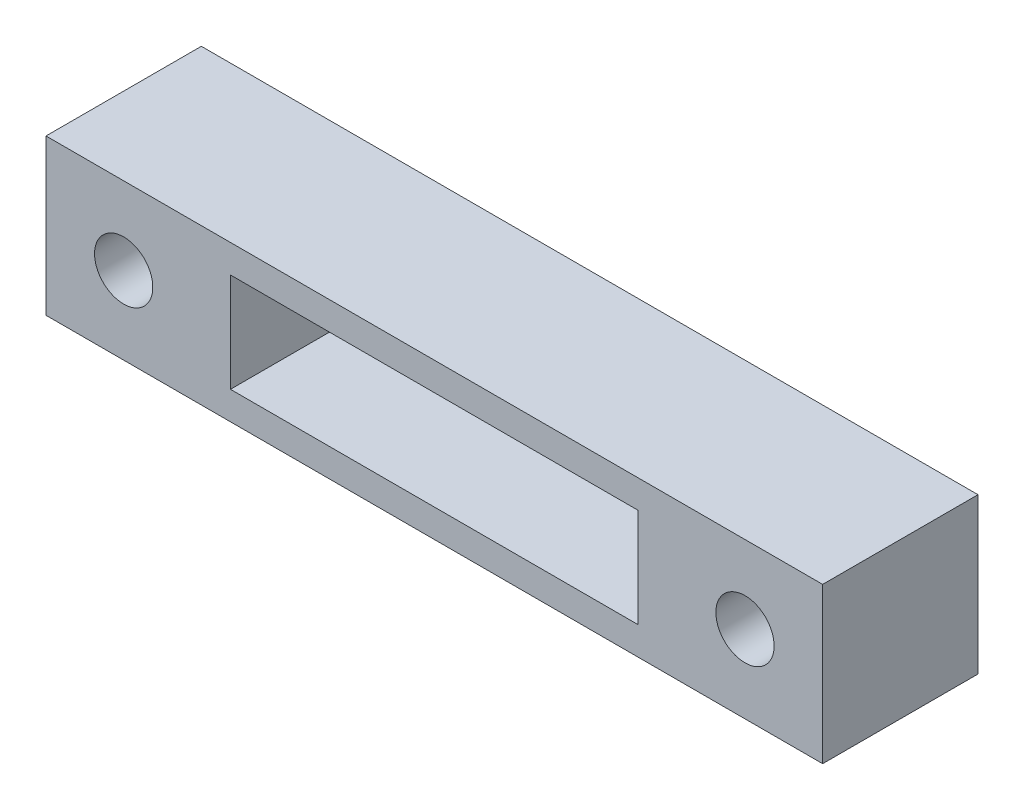
ISO-10303-21;
HEADER;
FILE_DESCRIPTION(('STEP AP214'),'2;1');
FILE_NAME('part.step','',(''),(''),'','','');
FILE_SCHEMA(('AUTOMOTIVE_DESIGN { 1 0 10303 214 1 1 1 1 }'));
ENDSEC;
DATA;
#1=APPLICATION_CONTEXT('core data for automotive mechanical design processes');
#2=APPLICATION_PROTOCOL_DEFINITION('international standard','automotive_design',2000,#1);
#3=PRODUCT_CONTEXT('',#1,'mechanical');
#4=PRODUCT('Part','Part','',(#3));
#5=PRODUCT_RELATED_PRODUCT_CATEGORY('part','',(#4));
#6=PRODUCT_DEFINITION_FORMATION('','',#4);
#7=PRODUCT_DEFINITION_CONTEXT('part definition',#1,'design');
#8=PRODUCT_DEFINITION('design','',#6,#7);
#9=PRODUCT_DEFINITION_SHAPE('','',#8);
#10=(LENGTH_UNIT() NAMED_UNIT(*) SI_UNIT(.MILLI.,.METRE.));
#11=(NAMED_UNIT(*) PLANE_ANGLE_UNIT() SI_UNIT($,.RADIAN.));
#12=(NAMED_UNIT(*) SI_UNIT($,.STERADIAN.) SOLID_ANGLE_UNIT());
#13=UNCERTAINTY_MEASURE_WITH_UNIT(LENGTH_MEASURE(1.E-05),#10,'distance_accuracy_value','');
#14=(GEOMETRIC_REPRESENTATION_CONTEXT(3) GLOBAL_UNCERTAINTY_ASSIGNED_CONTEXT((#13)) GLOBAL_UNIT_ASSIGNED_CONTEXT((#10,
#11,#12)) REPRESENTATION_CONTEXT('',''));
#15=CARTESIAN_POINT('',(0.,0.,0.));
#16=DIRECTION('',(0.,0.,1.));
#17=DIRECTION('',(1.,0.,0.));
#18=AXIS2_PLACEMENT_3D('',#15,#16,#17);
#19=CARTESIAN_POINT('',(0.,0.,-17.5));
#20=DIRECTION('',(0.,0.,1.));
#21=DIRECTION('',(1.,0.,0.));
#22=AXIS2_PLACEMENT_3D('',#19,#20,#21);
#23=PLANE('',#22);
#24=DIRECTION('',(1.,0.,0.));
#25=VECTOR('',#24,1.);
#26=CARTESIAN_POINT('',(-10.5,1.45,-17.5));
#27=LINE('',#26,#25);
#28=CARTESIAN_POINT('',(-10.5,1.45,-17.5));
#29=VERTEX_POINT('',#28);
#30=CARTESIAN_POINT('',(10.5,1.45,-17.5));
#31=VERTEX_POINT('',#30);
#32=EDGE_CURVE('E180',#29,#31,#27,.T.);
#33=ORIENTED_EDGE('',*,*,#32,.T.);
#34=DIRECTION('',(0.,1.,0.));
#35=VECTOR('',#34,1.);
#36=CARTESIAN_POINT('',(10.5,1.45,-17.5));
#37=LINE('',#36,#35);
#38=CARTESIAN_POINT('',(10.5,6.55,-17.5));
#39=VERTEX_POINT('',#38);
#40=EDGE_CURVE('E184',#31,#39,#37,.T.);
#41=ORIENTED_EDGE('',*,*,#40,.T.);
#42=DIRECTION('',(1.,0.,0.));
#43=VECTOR('',#42,1.);
#44=CARTESIAN_POINT('',(-10.5,6.55,-17.5));
#45=LINE('',#44,#43);
#46=CARTESIAN_POINT('',(-10.5,6.55,-17.5));
#47=VERTEX_POINT('',#46);
#48=EDGE_CURVE('E189',#47,#39,#45,.T.);
#49=ORIENTED_EDGE('',*,*,#48,.F.);
#50=DIRECTION('',(0.,1.,0.));
#51=VECTOR('',#50,1.);
#52=CARTESIAN_POINT('',(-10.5,1.45,-17.5));
#53=LINE('',#52,#51);
#54=EDGE_CURVE('E192',#29,#47,#53,.T.);
#55=ORIENTED_EDGE('',*,*,#54,.F.);
#56=EDGE_LOOP('',(#33,#41,#49,#55));
#57=FACE_BOUND('',#56,.T.);
#58=DIRECTION('',(1.,0.,0.));
#59=VECTOR('',#58,1.);
#60=CARTESIAN_POINT('',(-9.,2.5,-17.5));
#61=LINE('',#60,#59);
#62=CARTESIAN_POINT('',(-9.,2.5,-17.5));
#63=VERTEX_POINT('',#62);
#64=CARTESIAN_POINT('',(9.,2.5,-17.5));
#65=VERTEX_POINT('',#64);
#66=EDGE_CURVE('E159',#63,#65,#61,.T.);
#67=ORIENTED_EDGE('',*,*,#66,.F.);
#68=DIRECTION('',(0.,1.,0.));
#69=VECTOR('',#68,1.);
#70=CARTESIAN_POINT('',(-9.,2.5,-17.5));
#71=LINE('',#70,#69);
#72=CARTESIAN_POINT('',(-9.,5.5,-17.5));
#73=VERTEX_POINT('',#72);
#74=EDGE_CURVE('E145',#63,#73,#71,.T.);
#75=ORIENTED_EDGE('',*,*,#74,.T.);
#76=DIRECTION('',(1.,0.,0.));
#77=VECTOR('',#76,1.);
#78=CARTESIAN_POINT('',(-9.,5.5,-17.5));
#79=LINE('',#78,#77);
#80=CARTESIAN_POINT('',(9.,5.5,-17.5));
#81=VERTEX_POINT('',#80);
#82=EDGE_CURVE('E154',#73,#81,#79,.T.);
#83=ORIENTED_EDGE('',*,*,#82,.T.);
#84=DIRECTION('',(0.,1.,0.));
#85=VECTOR('',#84,1.);
#86=CARTESIAN_POINT('',(9.,2.5,-17.5));
#87=LINE('',#86,#85);
#88=EDGE_CURVE('E65',#65,#81,#87,.T.);
#89=ORIENTED_EDGE('',*,*,#88,.F.);
#90=EDGE_LOOP('',(#67,#75,#83,#89));
#91=FACE_BOUND('',#90,.T.);
#92=ADVANCED_FACE('F47',(#57,#91),#23,.T.);
#93=CARTESIAN_POINT('',(0.,8.,-20.));
#94=DIRECTION('',(0.,0.,-1.));
#95=DIRECTION('',(-1.,0.,0.));
#96=AXIS2_PLACEMENT_3D('',#93,#94,#95);
#97=PLANE('',#96);
#98=CARTESIAN_POINT('',(16.,4.,-20.));
#99=DIRECTION('',(0.,0.,-1.));
#100=DIRECTION('',(-1.,0.,0.));
#101=AXIS2_PLACEMENT_3D('',#98,#99,#100);
#102=CIRCLE('',#101,1.5);
#103=CARTESIAN_POINT('',(14.5,4.,-20.));
#104=VERTEX_POINT('',#103);
#105=EDGE_CURVE('E272',#104,#104,#102,.T.);
#106=ORIENTED_EDGE('',*,*,#105,.F.);
#107=EDGE_LOOP('',(#106));
#108=FACE_BOUND('',#107,.T.);
#109=CARTESIAN_POINT('',(-16.,3.99999999999997,-20.));
#110=DIRECTION('',(0.,0.,-1.));
#111=DIRECTION('',(1.,0.,0.));
#112=AXIS2_PLACEMENT_3D('',#109,#110,#111);
#113=CIRCLE('',#112,1.5);
#114=CARTESIAN_POINT('',(-14.5,3.99999999999997,-20.));
#115=VERTEX_POINT('',#114);
#116=EDGE_CURVE('E166',#115,#115,#113,.T.);
#117=ORIENTED_EDGE('',*,*,#116,.F.);
#118=EDGE_LOOP('',(#117));
#119=FACE_BOUND('',#118,.T.);
#120=DIRECTION('',(1.,0.,0.));
#121=VECTOR('',#120,1.);
#122=CARTESIAN_POINT('',(0.,0.,-20.));
#123=LINE('',#122,#121);
#124=CARTESIAN_POINT('',(-20.,0.,-20.));
#125=VERTEX_POINT('',#124);
#126=CARTESIAN_POINT('',(20.,0.,-20.));
#127=VERTEX_POINT('',#126);
#128=EDGE_CURVE('E227',#125,#127,#123,.T.);
#129=ORIENTED_EDGE('',*,*,#128,.F.);
#130=DIRECTION('',(0.,-1.,0.));
#131=VECTOR('',#130,1.);
#132=CARTESIAN_POINT('',(-20.,8.,-20.));
#133=LINE('',#132,#131);
#134=CARTESIAN_POINT('',(-20.,8.,-20.));
#135=VERTEX_POINT('',#134);
#136=EDGE_CURVE('E237',#135,#125,#133,.T.);
#137=ORIENTED_EDGE('',*,*,#136,.F.);
#138=DIRECTION('',(1.,0.,0.));
#139=VECTOR('',#138,1.);
#140=CARTESIAN_POINT('',(0.,8.,-20.));
#141=LINE('',#140,#139);
#142=CARTESIAN_POINT('',(20.,8.,-20.));
#143=VERTEX_POINT('',#142);
#144=EDGE_CURVE('E233',#135,#143,#141,.T.);
#145=ORIENTED_EDGE('',*,*,#144,.T.);
#146=DIRECTION('',(0.,-1.,0.));
#147=VECTOR('',#146,1.);
#148=CARTESIAN_POINT('',(20.,8.,-20.));
#149=LINE('',#148,#147);
#150=EDGE_CURVE('E253',#143,#127,#149,.T.);
#151=ORIENTED_EDGE('',*,*,#150,.T.);
#152=EDGE_LOOP('',(#129,#137,#145,#151));
#153=FACE_BOUND('',#152,.T.);
#154=DIRECTION('',(-1.,0.,0.));
#155=VECTOR('',#154,1.);
#156=CARTESIAN_POINT('',(0.,5.5,-20.));
#157=LINE('',#156,#155);
#158=CARTESIAN_POINT('',(9.,5.5,-20.));
#159=VERTEX_POINT('',#158);
#160=CARTESIAN_POINT('',(-9.,5.5,-20.));
#161=VERTEX_POINT('',#160);
#162=EDGE_CURVE('E57',#159,#161,#157,.T.);
#163=ORIENTED_EDGE('',*,*,#162,.T.);
#164=DIRECTION('',(0.,-1.,0.));
#165=VECTOR('',#164,1.);
#166=CARTESIAN_POINT('',(-9.,8.,-20.));
#167=LINE('',#166,#165);
#168=CARTESIAN_POINT('',(-9.,2.5,-20.));
#169=VERTEX_POINT('',#168);
#170=EDGE_CURVE('E11',#161,#169,#167,.T.);
#171=ORIENTED_EDGE('',*,*,#170,.T.);
#172=DIRECTION('',(-1.,0.,0.));
#173=VECTOR('',#172,1.);
#174=CARTESIAN_POINT('',(0.,2.5,-20.));
#175=LINE('',#174,#173);
#176=CARTESIAN_POINT('',(9.,2.5,-20.));
#177=VERTEX_POINT('',#176);
#178=EDGE_CURVE('E263',#177,#169,#175,.T.);
#179=ORIENTED_EDGE('',*,*,#178,.F.);
#180=DIRECTION('',(0.,-1.,0.));
#181=VECTOR('',#180,1.);
#182=CARTESIAN_POINT('',(9.,8.,-20.));
#183=LINE('',#182,#181);
#184=EDGE_CURVE('E266',#159,#177,#183,.T.);
#185=ORIENTED_EDGE('',*,*,#184,.F.);
#186=EDGE_LOOP('',(#163,#171,#179,#185));
#187=FACE_BOUND('',#186,.T.);
#188=ADVANCED_FACE('F286',(#108,#119,#153,#187),#97,.T.);
#189=CARTESIAN_POINT('',(-20.,8.,0.));
#190=DIRECTION('',(-1.,0.,0.));
#191=DIRECTION('',(0.,0.,1.));
#192=AXIS2_PLACEMENT_3D('',#189,#190,#191);
#193=PLANE('',#192);
#194=DIRECTION('',(0.,0.,-1.));
#195=VECTOR('',#194,1.);
#196=CARTESIAN_POINT('',(-20.,0.,0.));
#197=LINE('',#196,#195);
#198=CARTESIAN_POINT('',(-20.,0.,-12.));
#199=VERTEX_POINT('',#198);
#200=EDGE_CURVE('E212',#199,#125,#197,.T.);
#201=ORIENTED_EDGE('',*,*,#200,.F.);
#202=DIRECTION('',(0.,-1.,0.));
#203=VECTOR('',#202,1.);
#204=CARTESIAN_POINT('',(-20.,8.,-12.));
#205=LINE('',#204,#203);
#206=CARTESIAN_POINT('',(-20.,8.,-12.));
#207=VERTEX_POINT('',#206);
#208=EDGE_CURVE('E260',#207,#199,#205,.T.);
#209=ORIENTED_EDGE('',*,*,#208,.F.);
#210=DIRECTION('',(0.,0.,-1.));
#211=VECTOR('',#210,1.);
#212=CARTESIAN_POINT('',(-20.,8.,0.));
#213=LINE('',#212,#211);
#214=EDGE_CURVE('E222',#207,#135,#213,.T.);
#215=ORIENTED_EDGE('',*,*,#214,.T.);
#216=ORIENTED_EDGE('',*,*,#136,.T.);
#217=EDGE_LOOP('',(#201,#209,#215,#216));
#218=FACE_BOUND('',#217,.T.);
#219=ADVANCED_FACE('F49',(#218),#193,.T.);
#220=CARTESIAN_POINT('',(0.,8.,-12.));
#221=DIRECTION('',(0.,0.,-1.));
#222=DIRECTION('',(-1.,0.,0.));
#223=AXIS2_PLACEMENT_3D('',#220,#221,#222);
#224=PLANE('',#223);
#225=CARTESIAN_POINT('',(16.,4.,-12.));
#226=DIRECTION('',(0.,0.,-1.));
#227=DIRECTION('',(-1.,0.,0.));
#228=AXIS2_PLACEMENT_3D('',#225,#226,#227);
#229=CIRCLE('',#228,1.5);
#230=CARTESIAN_POINT('',(14.5,4.,-12.));
#231=VERTEX_POINT('',#230);
#232=EDGE_CURVE('E51',#231,#231,#229,.T.);
#233=ORIENTED_EDGE('',*,*,#232,.T.);
#234=EDGE_LOOP('',(#233));
#235=FACE_BOUND('',#234,.T.);
#236=CARTESIAN_POINT('',(-16.,3.99999999999997,-12.));
#237=DIRECTION('',(0.,0.,-1.));
#238=DIRECTION('',(-1.,0.,0.));
#239=AXIS2_PLACEMENT_3D('',#236,#237,#238);
#240=CIRCLE('',#239,1.5);
#241=CARTESIAN_POINT('',(-17.5,3.99999999999997,-12.));
#242=VERTEX_POINT('',#241);
#243=EDGE_CURVE('E164',#242,#242,#240,.T.);
#244=ORIENTED_EDGE('',*,*,#243,.T.);
#245=EDGE_LOOP('',(#244));
#246=FACE_BOUND('',#245,.T.);
#247=DIRECTION('',(0.,1.,0.));
#248=VECTOR('',#247,1.);
#249=CARTESIAN_POINT('',(10.5,1.45,-12.));
#250=LINE('',#249,#248);
#251=CARTESIAN_POINT('',(10.5,1.45,-12.));
#252=VERTEX_POINT('',#251);
#253=CARTESIAN_POINT('',(10.5,6.55,-12.));
#254=VERTEX_POINT('',#253);
#255=EDGE_CURVE('E198',#252,#254,#250,.T.);
#256=ORIENTED_EDGE('',*,*,#255,.F.);
#257=DIRECTION('',(1.,0.,0.));
#258=VECTOR('',#257,1.);
#259=CARTESIAN_POINT('',(-10.5,1.45,-12.));
#260=LINE('',#259,#258);
#261=CARTESIAN_POINT('',(-10.5,1.45,-12.));
#262=VERTEX_POINT('',#261);
#263=EDGE_CURVE('E150',#262,#252,#260,.T.);
#264=ORIENTED_EDGE('',*,*,#263,.F.);
#265=DIRECTION('',(0.,1.,0.));
#266=VECTOR('',#265,1.);
#267=CARTESIAN_POINT('',(-10.5,1.45,-12.));
#268=LINE('',#267,#266);
#269=CARTESIAN_POINT('',(-10.5,6.55,-12.));
#270=VERTEX_POINT('',#269);
#271=EDGE_CURVE('E185',#262,#270,#268,.T.);
#272=ORIENTED_EDGE('',*,*,#271,.T.);
#273=DIRECTION('',(1.,0.,0.));
#274=VECTOR('',#273,1.);
#275=CARTESIAN_POINT('',(-10.5,6.55,-12.));
#276=LINE('',#275,#274);
#277=EDGE_CURVE('E202',#270,#254,#276,.T.);
#278=ORIENTED_EDGE('',*,*,#277,.T.);
#279=EDGE_LOOP('',(#256,#264,#272,#278));
#280=FACE_BOUND('',#279,.T.);
#281=DIRECTION('',(1.,0.,0.));
#282=VECTOR('',#281,1.);
#283=CARTESIAN_POINT('',(0.,0.,-12.));
#284=LINE('',#283,#282);
#285=CARTESIAN_POINT('',(20.,0.,-12.));
#286=VERTEX_POINT('',#285);
#287=EDGE_CURVE('E241',#199,#286,#284,.T.);
#288=ORIENTED_EDGE('',*,*,#287,.T.);
#289=DIRECTION('',(0.,-1.,0.));
#290=VECTOR('',#289,1.);
#291=CARTESIAN_POINT('',(20.,8.,-12.));
#292=LINE('',#291,#290);
#293=CARTESIAN_POINT('',(20.,8.,-12.));
#294=VERTEX_POINT('',#293);
#295=EDGE_CURVE('E256',#294,#286,#292,.T.);
#296=ORIENTED_EDGE('',*,*,#295,.F.);
#297=DIRECTION('',(1.,0.,0.));
#298=VECTOR('',#297,1.);
#299=CARTESIAN_POINT('',(0.,8.,-12.));
#300=LINE('',#299,#298);
#301=EDGE_CURVE('E226',#207,#294,#300,.T.);
#302=ORIENTED_EDGE('',*,*,#301,.F.);
#303=ORIENTED_EDGE('',*,*,#208,.T.);
#304=EDGE_LOOP('',(#288,#296,#302,#303));
#305=FACE_BOUND('',#304,.T.);
#306=ADVANCED_FACE('F341',(#235,#246,#280,#305),#224,.F.);
#307=CARTESIAN_POINT('',(20.,8.,0.));
#308=DIRECTION('',(-1.,0.,0.));
#309=DIRECTION('',(0.,0.,1.));
#310=AXIS2_PLACEMENT_3D('',#307,#308,#309);
#311=PLANE('',#310);
#312=DIRECTION('',(0.,0.,-1.));
#313=VECTOR('',#312,1.);
#314=CARTESIAN_POINT('',(20.,0.,0.));
#315=LINE('',#314,#313);
#316=EDGE_CURVE('E244',#286,#127,#315,.T.);
#317=ORIENTED_EDGE('',*,*,#316,.T.);
#318=ORIENTED_EDGE('',*,*,#150,.F.);
#319=DIRECTION('',(0.,0.,-1.));
#320=VECTOR('',#319,1.);
#321=CARTESIAN_POINT('',(20.,8.,0.));
#322=LINE('',#321,#320);
#323=EDGE_CURVE('E230',#294,#143,#322,.T.);
#324=ORIENTED_EDGE('',*,*,#323,.F.);
#325=ORIENTED_EDGE('',*,*,#295,.T.);
#326=EDGE_LOOP('',(#317,#318,#324,#325));
#327=FACE_BOUND('',#326,.T.);
#328=ADVANCED_FACE('F335',(#327),#311,.F.);
#329=CARTESIAN_POINT('',(0.,8.,0.));
#330=DIRECTION('',(0.,1.,0.));
#331=DIRECTION('',(0.,0.,1.));
#332=AXIS2_PLACEMENT_3D('',#329,#330,#331);
#333=PLANE('',#332);
#334=ORIENTED_EDGE('',*,*,#214,.F.);
#335=ORIENTED_EDGE('',*,*,#301,.T.);
#336=ORIENTED_EDGE('',*,*,#323,.T.);
#337=ORIENTED_EDGE('',*,*,#144,.F.);
#338=EDGE_LOOP('',(#334,#335,#336,#337));
#339=FACE_BOUND('',#338,.T.);
#340=ADVANCED_FACE('F332',(#339),#333,.T.);
#341=CARTESIAN_POINT('',(0.,0.,0.));
#342=DIRECTION('',(0.,1.,0.));
#343=DIRECTION('',(0.,0.,1.));
#344=AXIS2_PLACEMENT_3D('',#341,#342,#343);
#345=PLANE('',#344);
#346=ORIENTED_EDGE('',*,*,#200,.T.);
#347=ORIENTED_EDGE('',*,*,#128,.T.);
#348=ORIENTED_EDGE('',*,*,#316,.F.);
#349=ORIENTED_EDGE('',*,*,#287,.F.);
#350=EDGE_LOOP('',(#346,#347,#348,#349));
#351=FACE_BOUND('',#350,.T.);
#352=ADVANCED_FACE('F330',(#351),#345,.F.);
#353=CARTESIAN_POINT('',(-10.5,1.45,-17.5));
#354=DIRECTION('',(0.,-1.,0.));
#355=DIRECTION('',(0.,0.,-1.));
#356=AXIS2_PLACEMENT_3D('',#353,#354,#355);
#357=PLANE('',#356);
#358=ORIENTED_EDGE('',*,*,#263,.T.);
#359=DIRECTION('',(0.,0.,1.));
#360=VECTOR('',#359,1.);
#361=CARTESIAN_POINT('',(10.5,1.45,-17.5));
#362=LINE('',#361,#360);
#363=EDGE_CURVE('E195',#31,#252,#362,.T.);
#364=ORIENTED_EDGE('',*,*,#363,.F.);
#365=ORIENTED_EDGE('',*,*,#32,.F.);
#366=DIRECTION('',(0.,0.,1.));
#367=VECTOR('',#366,1.);
#368=CARTESIAN_POINT('',(-10.5,1.45,-17.5));
#369=LINE('',#368,#367);
#370=EDGE_CURVE('E209',#29,#262,#369,.T.);
#371=ORIENTED_EDGE('',*,*,#370,.T.);
#372=EDGE_LOOP('',(#358,#364,#365,#371));
#373=FACE_BOUND('',#372,.T.);
#374=ADVANCED_FACE('F320',(#373),#357,.F.);
#375=CARTESIAN_POINT('',(-10.5,1.45,-17.5));
#376=DIRECTION('',(1.,0.,0.));
#377=DIRECTION('',(0.,0.,-1.));
#378=AXIS2_PLACEMENT_3D('',#375,#376,#377);
#379=PLANE('',#378);
#380=ORIENTED_EDGE('',*,*,#271,.F.);
#381=ORIENTED_EDGE('',*,*,#370,.F.);
#382=ORIENTED_EDGE('',*,*,#54,.T.);
#383=DIRECTION('',(0.,0.,1.));
#384=VECTOR('',#383,1.);
#385=CARTESIAN_POINT('',(-10.5,6.55,-17.5));
#386=LINE('',#385,#384);
#387=EDGE_CURVE('E213',#47,#270,#386,.T.);
#388=ORIENTED_EDGE('',*,*,#387,.T.);
#389=EDGE_LOOP('',(#380,#381,#382,#388));
#390=FACE_BOUND('',#389,.T.);
#391=ADVANCED_FACE('F316',(#390),#379,.T.);
#392=CARTESIAN_POINT('',(-10.5,6.55,-17.5));
#393=DIRECTION('',(0.,-1.,0.));
#394=DIRECTION('',(0.,0.,-1.));
#395=AXIS2_PLACEMENT_3D('',#392,#393,#394);
#396=PLANE('',#395);
#397=ORIENTED_EDGE('',*,*,#277,.F.);
#398=ORIENTED_EDGE('',*,*,#387,.F.);
#399=ORIENTED_EDGE('',*,*,#48,.T.);
#400=DIRECTION('',(0.,0.,1.));
#401=VECTOR('',#400,1.);
#402=CARTESIAN_POINT('',(10.5,6.55,-17.5));
#403=LINE('',#402,#401);
#404=EDGE_CURVE('E216',#39,#254,#403,.T.);
#405=ORIENTED_EDGE('',*,*,#404,.T.);
#406=EDGE_LOOP('',(#397,#398,#399,#405));
#407=FACE_BOUND('',#406,.T.);
#408=ADVANCED_FACE('F319',(#407),#396,.T.);
#409=CARTESIAN_POINT('',(10.5,1.45,-17.5));
#410=DIRECTION('',(1.,0.,0.));
#411=DIRECTION('',(0.,0.,-1.));
#412=AXIS2_PLACEMENT_3D('',#409,#410,#411);
#413=PLANE('',#412);
#414=ORIENTED_EDGE('',*,*,#255,.T.);
#415=ORIENTED_EDGE('',*,*,#404,.F.);
#416=ORIENTED_EDGE('',*,*,#40,.F.);
#417=ORIENTED_EDGE('',*,*,#363,.T.);
#418=EDGE_LOOP('',(#414,#415,#416,#417));
#419=FACE_BOUND('',#418,.T.);
#420=ADVANCED_FACE('F324',(#419),#413,.F.);
#421=CARTESIAN_POINT('',(-9.,2.5,-23.));
#422=DIRECTION('',(1.,0.,0.));
#423=DIRECTION('',(0.,0.,-1.));
#424=AXIS2_PLACEMENT_3D('',#421,#422,#423);
#425=PLANE('',#424);
#426=DIRECTION('',(0.,0.,1.));
#427=VECTOR('',#426,1.);
#428=CARTESIAN_POINT('',(-9.,5.5,-23.));
#429=LINE('',#428,#427);
#430=EDGE_CURVE('E140',#161,#73,#429,.T.);
#431=ORIENTED_EDGE('',*,*,#430,.T.);
#432=ORIENTED_EDGE('',*,*,#74,.F.);
#433=DIRECTION('',(0.,0.,1.));
#434=VECTOR('',#433,1.);
#435=CARTESIAN_POINT('',(-9.,2.5,-23.));
#436=LINE('',#435,#434);
#437=EDGE_CURVE('E173',#169,#63,#436,.T.);
#438=ORIENTED_EDGE('',*,*,#437,.F.);
#439=ORIENTED_EDGE('',*,*,#170,.F.);
#440=EDGE_LOOP('',(#431,#432,#438,#439));
#441=FACE_BOUND('',#440,.T.);
#442=ADVANCED_FACE('F142',(#441),#425,.T.);
#443=CARTESIAN_POINT('',(-9.,5.5,-23.));
#444=DIRECTION('',(0.,-1.,0.));
#445=DIRECTION('',(0.,0.,-1.));
#446=AXIS2_PLACEMENT_3D('',#443,#444,#445);
#447=PLANE('',#446);
#448=DIRECTION('',(0.,0.,1.));
#449=VECTOR('',#448,1.);
#450=CARTESIAN_POINT('',(9.,5.5,-23.));
#451=LINE('',#450,#449);
#452=EDGE_CURVE('E151',#159,#81,#451,.T.);
#453=ORIENTED_EDGE('',*,*,#452,.T.);
#454=ORIENTED_EDGE('',*,*,#82,.F.);
#455=ORIENTED_EDGE('',*,*,#430,.F.);
#456=ORIENTED_EDGE('',*,*,#162,.F.);
#457=EDGE_LOOP('',(#453,#454,#455,#456));
#458=FACE_BOUND('',#457,.T.);
#459=ADVANCED_FACE('F155',(#458),#447,.T.);
#460=CARTESIAN_POINT('',(9.,2.5,-23.));
#461=DIRECTION('',(1.,0.,0.));
#462=DIRECTION('',(0.,0.,-1.));
#463=AXIS2_PLACEMENT_3D('',#460,#461,#462);
#464=PLANE('',#463);
#465=ORIENTED_EDGE('',*,*,#184,.T.);
#466=DIRECTION('',(0.,0.,1.));
#467=VECTOR('',#466,1.);
#468=CARTESIAN_POINT('',(9.,2.5,-23.));
#469=LINE('',#468,#467);
#470=EDGE_CURVE('E72',#177,#65,#469,.T.);
#471=ORIENTED_EDGE('',*,*,#470,.T.);
#472=ORIENTED_EDGE('',*,*,#88,.T.);
#473=ORIENTED_EDGE('',*,*,#452,.F.);
#474=EDGE_LOOP('',(#465,#471,#472,#473));
#475=FACE_BOUND('',#474,.T.);
#476=ADVANCED_FACE('F295',(#475),#464,.F.);
#477=CARTESIAN_POINT('',(-9.,2.5,-23.));
#478=DIRECTION('',(0.,-1.,0.));
#479=DIRECTION('',(0.,0.,-1.));
#480=AXIS2_PLACEMENT_3D('',#477,#478,#479);
#481=PLANE('',#480);
#482=ORIENTED_EDGE('',*,*,#178,.T.);
#483=ORIENTED_EDGE('',*,*,#437,.T.);
#484=ORIENTED_EDGE('',*,*,#66,.T.);
#485=ORIENTED_EDGE('',*,*,#470,.F.);
#486=EDGE_LOOP('',(#482,#483,#484,#485));
#487=FACE_BOUND('',#486,.T.);
#488=ADVANCED_FACE('F296',(#487),#481,.F.);
#489=CARTESIAN_POINT('',(-16.,3.99999999999997,-9.49999999999999));
#490=DIRECTION('',(0.,0.,-1.));
#491=DIRECTION('',(-1.,0.,0.));
#492=AXIS2_PLACEMENT_3D('',#489,#490,#491);
#493=CYLINDRICAL_SURFACE('',#492,1.5);
#494=ORIENTED_EDGE('',*,*,#116,.T.);
#495=EDGE_LOOP('',(#494));
#496=FACE_BOUND('',#495,.T.);
#497=ORIENTED_EDGE('',*,*,#243,.F.);
#498=EDGE_LOOP('',(#497));
#499=FACE_BOUND('',#498,.T.);
#500=ADVANCED_FACE('F283',(#496,#499),#493,.F.);
#501=CARTESIAN_POINT('',(16.,4.,-9.49999999999999));
#502=DIRECTION('',(0.,0.,-1.));
#503=DIRECTION('',(-1.,0.,0.));
#504=AXIS2_PLACEMENT_3D('',#501,#502,#503);
#505=CYLINDRICAL_SURFACE('',#504,1.5);
#506=ORIENTED_EDGE('',*,*,#105,.T.);
#507=EDGE_LOOP('',(#506));
#508=FACE_BOUND('',#507,.T.);
#509=ORIENTED_EDGE('',*,*,#232,.F.);
#510=EDGE_LOOP('',(#509));
#511=FACE_BOUND('',#510,.T.);
#512=ADVANCED_FACE('F303',(#508,#511),#505,.F.);
#513=CLOSED_SHELL('',(#92,#188,#219,#306,#328,#340,#352,#374,#391,#408,#420,#442,#459,#476,#488,
#500,#512));
#514=MANIFOLD_SOLID_BREP('B2',#513);
#515=ADVANCED_BREP_SHAPE_REPRESENTATION('',(#18,#514),#14);
#516=SHAPE_DEFINITION_REPRESENTATION(#9,#515);
ENDSEC;
END-ISO-10303-21;
